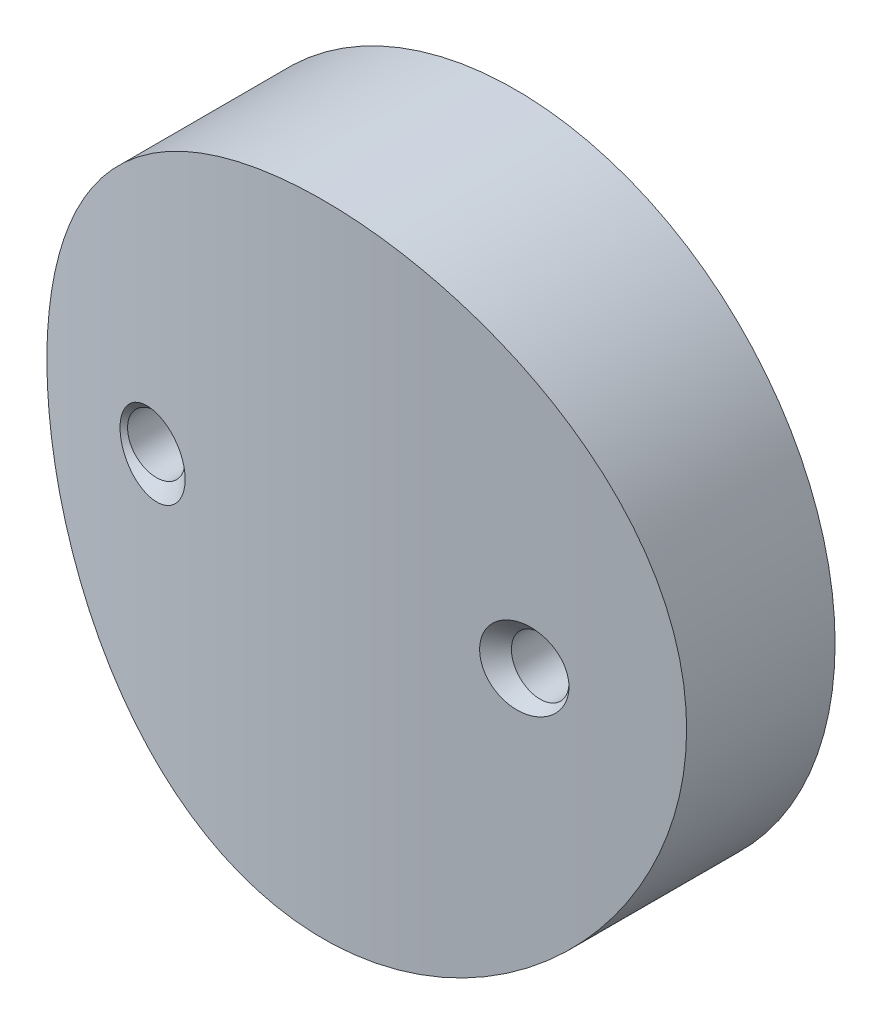
ISO-10303-21;
HEADER;
FILE_DESCRIPTION(('STEP AP214'),'2;1');
FILE_NAME('part.step','',(''),(''),'','','');
FILE_SCHEMA(('AUTOMOTIVE_DESIGN { 1 0 10303 214 1 1 1 1 }'));
ENDSEC;
DATA;
#1=APPLICATION_CONTEXT('core data for automotive mechanical design processes');
#2=APPLICATION_PROTOCOL_DEFINITION('international standard','automotive_design',2000,#1);
#3=PRODUCT_CONTEXT('',#1,'mechanical');
#4=PRODUCT('Part','Part','',(#3));
#5=PRODUCT_RELATED_PRODUCT_CATEGORY('part','',(#4));
#6=PRODUCT_DEFINITION_FORMATION('','',#4);
#7=PRODUCT_DEFINITION_CONTEXT('part definition',#1,'design');
#8=PRODUCT_DEFINITION('design','',#6,#7);
#9=PRODUCT_DEFINITION_SHAPE('','',#8);
#10=(LENGTH_UNIT() NAMED_UNIT(*) SI_UNIT(.MILLI.,.METRE.));
#11=(NAMED_UNIT(*) PLANE_ANGLE_UNIT() SI_UNIT($,.RADIAN.));
#12=(NAMED_UNIT(*) SI_UNIT($,.STERADIAN.) SOLID_ANGLE_UNIT());
#13=UNCERTAINTY_MEASURE_WITH_UNIT(LENGTH_MEASURE(1.E-05),#10,'distance_accuracy_value','');
#14=(GEOMETRIC_REPRESENTATION_CONTEXT(3) GLOBAL_UNCERTAINTY_ASSIGNED_CONTEXT((#13)) GLOBAL_UNIT_ASSIGNED_CONTEXT((#10,
#11,#12)) REPRESENTATION_CONTEXT('',''));
#15=CARTESIAN_POINT('',(0.,0.,0.));
#16=DIRECTION('',(0.,0.,1.));
#17=DIRECTION('',(1.,0.,0.));
#18=AXIS2_PLACEMENT_3D('',#15,#16,#17);
#19=CARTESIAN_POINT('',(0.,100.,12.001));
#20=DIRECTION('',(0.,0.,-1.));
#21=DIRECTION('',(-1.,0.,0.));
#22=AXIS2_PLACEMENT_3D('',#19,#20,#21);
#23=CYLINDRICAL_SURFACE('',#22,20.);
#24=CARTESIAN_POINT('',(0.,100.,0.));
#25=DIRECTION('',(0.,0.,1.));
#26=DIRECTION('',(1.,0.,0.));
#27=AXIS2_PLACEMENT_3D('',#24,#25,#26);
#28=CIRCLE('',#27,20.);
#29=CARTESIAN_POINT('',(20.,100.,0.));
#30=VERTEX_POINT('',#29);
#31=EDGE_CURVE('E43',#30,#30,#28,.T.);
#32=ORIENTED_EDGE('',*,*,#31,.T.);
#33=EDGE_LOOP('',(#32));
#34=FACE_BOUND('',#33,.T.);
#35=CARTESIAN_POINT('',(-20.,100.,9.28416147400479));
#36=CARTESIAN_POINT('',(-19.9999979955262,99.4490816313704,9.28416279580091));
#37=CARTESIAN_POINT('',(-19.9772172985185,98.8981249615404,9.2904769270564));
#38=CARTESIAN_POINT('',(-19.8862887267972,97.8002258474291,9.31554261359415));
#39=CARTESIAN_POINT('',(-19.818136610068,97.2532837833293,9.33429533182556));
#40=CARTESIAN_POINT('',(-19.6370216003391,96.1671652712574,9.38367345775294));
#41=CARTESIAN_POINT('',(-19.5240387775898,95.6279923877446,9.41430414573134));
#42=CARTESIAN_POINT('',(-19.2542283143095,94.561502969328,9.48651021139481));
#43=CARTESIAN_POINT('',(-19.0974015144497,94.0341862073026,9.52808537922789));
#44=CARTESIAN_POINT('',(-18.7414391089101,92.9957659565695,9.62087996482506));
#45=CARTESIAN_POINT('',(-18.5423642668867,92.4846403813565,9.67208551968243));
#46=CARTESIAN_POINT('',(-18.1033138320795,91.481199937916,9.78269878345931));
#47=CARTESIAN_POINT('',(-17.8633380829508,90.9888851416019,9.84210652373171));
#48=CARTESIAN_POINT('',(-17.3442340818241,90.0262034215537,9.9674503045261));
#49=CARTESIAN_POINT('',(-17.0651042648105,89.5558373761286,10.0333866059683));
#50=CARTESIAN_POINT('',(-16.4696340357336,88.6400041417255,10.1699694673951));
#51=CARTESIAN_POINT('',(-16.1532929930068,88.1945373749345,10.2406161072027));
#52=CARTESIAN_POINT('',(-15.4779359071113,87.3214778572301,10.3863439517671));
#53=CARTESIAN_POINT('',(-15.1181168094536,86.8945168185527,10.4614893018162));
#54=CARTESIAN_POINT('',(-14.3641394304632,86.072233894612,10.6126299952407));
#55=CARTESIAN_POINT('',(-13.9699806682643,85.6769124525539,10.6886253505059));
#56=CARTESIAN_POINT('',(-13.1498357209291,84.9204421049277,10.8393908335862));
#57=CARTESIAN_POINT('',(-12.7238463524525,84.5592966254637,10.9141608379413));
#58=CARTESIAN_POINT('',(-11.8428070794406,83.8736392228405,11.0604300185898));
#59=CARTESIAN_POINT('',(-11.3877570234234,83.5491274906629,11.1319291778303));
#60=CARTESIAN_POINT('',(-10.4440019186042,82.9340948969816,11.2708145890617));
#61=CARTESIAN_POINT('',(-9.95487366219161,82.6442038067541,11.3381163206586));
#62=CARTESIAN_POINT('',(-8.95295539825706,82.1067678347113,11.4654253046033));
#63=CARTESIAN_POINT('',(-8.44016506110064,81.859223543052,11.5254324552885));
#64=CARTESIAN_POINT('',(-7.39457532709894,81.4084882508209,11.6364292828246));
#65=CARTESIAN_POINT('',(-6.86177854741084,81.2052914724247,11.6874201342013));
#66=CARTESIAN_POINT('',(-5.77996599006893,80.8449220321236,11.7789182000641));
#67=CARTESIAN_POINT('',(-5.23095064420305,80.6877481461617,11.8194256933697));
#68=CARTESIAN_POINT('',(-4.13351206913607,80.4238601578316,11.8879789333952));
#69=CARTESIAN_POINT('',(-3.58536334092753,80.3160726833865,11.9162888769381));
#70=CARTESIAN_POINT('',(-2.4814919821342,80.1466883324669,11.9609717948869));
#71=CARTESIAN_POINT('',(-1.92576945639902,80.0850908172111,11.977344934372));
#72=CARTESIAN_POINT('',(-0.810972743979542,80.0086409767144,11.9976871281568));
#73=CARTESIAN_POINT('',(-0.251899056370223,79.9937818560937,12.0016579856462));
#74=CARTESIAN_POINT('',(0.865473785968113,80.0109243451164,11.9970870959432));
#75=CARTESIAN_POINT('',(1.42377295161553,80.0429252873166,11.9885455269695));
#76=CARTESIAN_POINT('',(2.52135571769306,80.1520981678641,11.9595660130407));
#77=CARTESIAN_POINT('',(3.06076341662817,80.2281086575775,11.9394340234098));
#78=CARTESIAN_POINT('',(4.13106184083255,80.4237319259216,11.8880589458923));
#79=CARTESIAN_POINT('',(4.66195273397212,80.5433438440421,11.8568160772884));
#80=CARTESIAN_POINT('',(5.71158477741187,80.8251959258982,11.7840530716063));
#81=CARTESIAN_POINT('',(6.23032550569826,80.9874375679151,11.7425325781311));
#82=CARTESIAN_POINT('',(7.25217189173379,81.3532705650216,11.650312846039));
#83=CARTESIAN_POINT('',(7.7552773024053,81.556862573169,11.5996134624586));
#84=CARTESIAN_POINT('',(8.74748028027973,82.0060818226882,11.4898194859816));
#85=CARTESIAN_POINT('',(9.23638947987451,82.2521058620114,11.4306466322478));
#86=CARTESIAN_POINT('',(10.1917867213777,82.7829692918916,11.3058518121301));
#87=CARTESIAN_POINT('',(10.6582746861091,83.0678088160437,11.2402298235499));
#88=CARTESIAN_POINT('',(11.5659888188201,83.6743783924377,11.1042412963293));
#89=CARTESIAN_POINT('',(12.0072108724652,83.9961144274876,11.0338739889947));
#90=CARTESIAN_POINT('',(12.86160363953,84.6743138427768,10.8902351506935));
#91=CARTESIAN_POINT('',(13.2747737611759,85.0307779552414,10.8169635585107));
#92=CARTESIAN_POINT('',(14.0827611991668,85.7876257785812,10.6671557118922));
#93=CARTESIAN_POINT('',(14.4766245221965,86.1890224381528,10.5905883226729));
#94=CARTESIAN_POINT('',(15.2292640199665,87.023663662894,10.4385250730246));
#95=CARTESIAN_POINT('',(15.5880394540543,87.4569089000012,10.3630292352433));
#96=CARTESIAN_POINT('',(16.2680947594536,88.3524583473953,10.2152321585712));
#97=CARTESIAN_POINT('',(16.5893720649617,88.8147645428476,10.1429311384955));
#98=CARTESIAN_POINT('',(17.192133875991,89.765388203695,10.0036044220981));
#99=CARTESIAN_POINT('',(17.4736185648671,90.2537055492225,9.93657870146968));
#100=CARTESIAN_POINT('',(17.9963259710692,91.2562147677768,9.80937506038609));
#101=CARTESIAN_POINT('',(18.2372879132319,91.7705484417095,9.74924223079678));
#102=CARTESIAN_POINT('',(18.6748920170533,92.8187094348841,9.63814020936753));
#103=CARTESIAN_POINT('',(18.8715338404755,93.3525369028601,9.58717108746262));
#104=CARTESIAN_POINT('',(19.2188038342948,94.4357402113817,9.49599876971939));
#105=CARTESIAN_POINT('',(19.3694413584335,94.9851128663764,9.45579338556878));
#106=CARTESIAN_POINT('',(19.6234178199717,96.0954178055354,9.3874216198644));
#107=CARTESIAN_POINT('',(19.726758202429,96.6563497359847,9.35925487049893));
#108=CARTESIAN_POINT('',(19.8828242188132,97.7685924306345,9.31652398335675));
#109=CARTESIAN_POINT('',(19.9369705715048,98.3196895369154,9.30157838257706));
#110=CARTESIAN_POINT('',(19.999379837248,99.424669527566,9.28434042019789));
#111=CARTESIAN_POINT('',(20.007643660691,99.9785523564438,9.28204780754049));
#112=CARTESIAN_POINT('',(19.9782160173178,101.084944616774,9.2901868221143));
#113=CARTESIAN_POINT('',(19.9405290358714,101.637454176999,9.30061720742275));
#114=CARTESIAN_POINT('',(19.8195451229315,102.737074698953,9.33387557665008));
#115=CARTESIAN_POINT('',(19.736248441784,103.284185690296,9.35670349252048));
#116=CARTESIAN_POINT('',(19.5268172340599,104.358574694533,9.41349951820374));
#117=CARTESIAN_POINT('',(19.4015386960339,104.886031740194,9.44724459132138));
#118=CARTESIAN_POINT('',(19.1088443049987,105.92832913383,9.52499551388795));
#119=CARTESIAN_POINT('',(18.9414291370062,106.443169686762,9.56900119652894));
#120=CARTESIAN_POINT('',(18.5657450389627,107.456898130884,9.6660217329505));
#121=CARTESIAN_POINT('',(18.3574721183883,107.955784458306,9.71903746666335));
#122=CARTESIAN_POINT('',(17.9016367197211,108.934361374954,9.8325926384959));
#123=CARTESIAN_POINT('',(17.6540733523817,109.414051529412,9.89313224689401));
#124=CARTESIAN_POINT('',(17.11548661598,110.361636468143,10.0214925631849));
#125=CARTESIAN_POINT('',(16.8236278146508,110.829040459727,10.0894440311411));
#126=CARTESIAN_POINT('',(16.3580352677298,111.510448657993,10.1945351891524));
#127=CARTESIAN_POINT('',(16.1981947427043,111.734312785837,10.2300948148337));
#128=CARTESIAN_POINT('',(15.8694473258497,112.175232006241,10.30203931338));
#129=CARTESIAN_POINT('',(15.7005382856018,112.392285465816,10.3384243806107));
#130=CARTESIAN_POINT('',(15.1806742573283,113.03262740184,10.4484348620577));
#131=CARTESIAN_POINT('',(14.8165313697738,113.445172032661,10.5229271869328));
#132=CARTESIAN_POINT('',(14.0555240451393,114.238838083619,10.6721964284326));
#133=CARTESIAN_POINT('',(13.6586592103083,114.619959121675,10.7469733485062));
#134=CARTESIAN_POINT('',(13.0347928155079,115.171495187348,10.8589235743963));
#135=CARTESIAN_POINT('',(12.8188356454708,115.354397584418,10.8967329624592));
#136=CARTESIAN_POINT('',(12.3793376328829,115.710889528931,10.9716276270557));
#137=CARTESIAN_POINT('',(12.1557986434177,115.884481325597,11.0087130770864));
#138=CARTESIAN_POINT('',(11.4742218917359,116.390928812047,11.1185122839076));
#139=CARTESIAN_POINT('',(11.0051905556007,116.709486469754,11.1897750240711));
#140=CARTESIAN_POINT('',(10.0412210351255,117.305930022683,11.3263808627377));
#141=CARTESIAN_POINT('',(9.54628362476042,117.583817132045,11.3917241379329));
#142=CARTESIAN_POINT('',(8.53378968620397,118.096863201607,11.5146590330854));
#143=CARTESIAN_POINT('',(8.01623352756529,118.332022859577,11.572250779627));
#144=CARTESIAN_POINT('',(6.96615659435087,118.756088506658,11.6776336514422));
#145=CARTESIAN_POINT('',(6.43377951172494,118.945332565737,11.7254959610589));
#146=CARTESIAN_POINT('',(5.35413230580837,119.278287553008,11.810603810812));
#147=CARTESIAN_POINT('',(4.80686220937867,119.421998563319,11.8478493700953));
#148=CARTESIAN_POINT('',(3.70156710346041,119.662610052446,11.9106449827694));
#149=CARTESIAN_POINT('',(3.14354409748073,119.759519165467,11.9361971933511));
#150=CARTESIAN_POINT('',(2.02086921872248,119.905690213793,11.9748725616934));
#151=CARTESIAN_POINT('',(1.45621751475103,119.954953359803,11.9879960352735));
#152=CARTESIAN_POINT('',(0.342006373503294,120.004609848884,12.0012258769284));
#153=CARTESIAN_POINT('',(-0.207484191740462,120.006457125849,12.0017195176386));
#154=CARTESIAN_POINT('',(-1.30462513984723,119.964951723101,11.9906587066234));
#155=CARTESIAN_POINT('',(-1.85227556263647,119.921600030522,11.9791045180198));
#156=CARTESIAN_POINT('',(-2.94176044403704,119.790076070703,11.9442666380802));
#157=CARTESIAN_POINT('',(-3.48359514787692,119.701905700952,11.9209834433156));
#158=CARTESIAN_POINT('',(-4.55762066338954,119.48149446132,11.86332430712));
#159=CARTESIAN_POINT('',(-5.08981143202368,119.349253394814,11.8289483161975));
#160=CARTESIAN_POINT('',(-6.13720586224473,119.042856430792,11.7503085861672));
#161=CARTESIAN_POINT('',(-6.65250160135733,118.868996968494,11.7061149287477));
#162=CARTESIAN_POINT('',(-7.66649937953354,118.480249488552,11.6088749781919));
#163=CARTESIAN_POINT('',(-8.16520155304267,118.265361803423,11.5558287568026));
#164=CARTESIAN_POINT('',(-9.14285422000933,117.796130197976,11.4422625249328));
#165=CARTESIAN_POINT('',(-9.6218026139965,117.541782097336,11.3817417227559));
#166=CARTESIAN_POINT('',(-10.5569031827026,116.995441768677,11.2547942715037));
#167=CARTESIAN_POINT('',(-11.0130548498786,116.703448703053,11.18836749103));
#168=CARTESIAN_POINT('',(-11.9116009680227,116.075513502516,11.0494829375575));
#169=CARTESIAN_POINT('',(-12.3533041573464,115.738607011052,10.976911573082));
#170=CARTESIAN_POINT('',(-13.2069343867793,115.029464192192,10.8292933222828));
#171=CARTESIAN_POINT('',(-13.6188608933488,114.65722723202,10.7542463916369));
#172=CARTESIAN_POINT('',(-14.4104174108039,113.879758554288,10.6036836894291));
#173=CARTESIAN_POINT('',(-14.7900392961781,113.474518585421,10.5281678050072));
#174=CARTESIAN_POINT('',(-15.5144184951873,112.633714559918,10.3787409432648));
#175=CARTESIAN_POINT('',(-15.8591756893648,112.198150399391,10.3048299714439));
#176=CARTESIAN_POINT('',(-16.5187203553849,111.289548436283,10.1590628608894));
#177=CARTESIAN_POINT('',(-16.8326805368298,110.815896583222,10.0872878300361));
#178=CARTESIAN_POINT('',(-17.4195128918304,109.842933134974,9.94965011832182));
#179=CARTESIAN_POINT('',(-17.6923831968983,109.343620374288,9.88378770638144));
#180=CARTESIAN_POINT('',(-18.1947791971653,108.323059432628,9.75999546091367));
#181=CARTESIAN_POINT('',(-18.424329875673,107.801824108278,9.70206106047311));
#182=CARTESIAN_POINT('',(-18.8383953760499,106.740847820869,9.59587184573519));
#183=CARTESIAN_POINT('',(-19.0229163281093,106.201109388183,9.54761571403154));
#184=CARTESIAN_POINT('',(-19.3189300896442,105.1967639913,9.46929221977677));
#185=CARTESIAN_POINT('',(-19.4374352166583,104.734340707335,9.43754006468277));
#186=CARTESIAN_POINT('',(-19.6411813358635,103.801567465641,9.38256119328311));
#187=CARTESIAN_POINT('',(-19.726413197448,103.33121536903,9.35933681721209));
#188=CARTESIAN_POINT('',(-19.8629973448247,102.385302182561,9.32196319394048));
#189=CARTESIAN_POINT('',(-19.9143527551861,101.90974157722,9.30781310978273));
#190=CARTESIAN_POINT('',(-19.9828499232124,100.956129746401,9.28891305807962));
#191=CARTESIAN_POINT('',(-20.0000017394545,100.478079294612,9.28416032696851));
#192=CARTESIAN_POINT('',(-20.,100.,9.28416147400479));
#193=B_SPLINE_CURVE_WITH_KNOTS('',3,(#35,#36,#37,#38,#39,#40,#41,#42,#43,#44,#45,#46,#47,#48,
#49,#50,#51,#52,#53,#54,#55,#56,#57,#58,#59,#60,#61,#62,#63,#64,#65,#66,#67,#68,#69,#70,#71,#72,
#73,#74,#75,#76,#77,#78,#79,#80,#81,#82,#83,#84,#85,#86,#87,#88,#89,#90,#91,#92,#93,#94,#95,#96,
#97,#98,#99,#100,#101,#102,#103,#104,#105,#106,#107,#108,#109,#110,#111,#112,#113,#114,#115,
#116,#117,#118,#119,#120,#121,#122,#123,#124,#125,#126,#127,#128,#129,#130,#131,#132,#133,#134,
#135,#136,#137,#138,#139,#140,#141,#142,#143,#144,#145,#146,#147,#148,#149,#150,#151,#152,#153,
#154,#155,#156,#157,#158,#159,#160,#161,#162,#163,#164,#165,#166,#167,#168,#169,#170,#171,#172,
#173,#174,#175,#176,#177,#178,#179,#180,#181,#182,#183,#184,#185,#186,#187,#188,#189,#190,#191,
#192),.UNSPECIFIED.,.T.,.F.,(4,2,2,2,2,2,2,2,2,2,2,2,2,2,2,2,2,2,2,2,2,2,2,2,2,2,2,2,2,2,2,2,2,
2,2,2,2,2,2,2,2,2,2,2,2,2,2,2,2,2,2,2,2,2,2,2,2,2,2,2,2,2,2,2,2,2,2,2,2,2,2,2,2,2,2,2,2,2,4),
(0.,1.65231646724919,3.30478744006707,4.95799385294114,6.61116856915921,8.26198151246524,
9.91280076618767,11.563686023129,13.2145992636445,14.9028332573599,16.5910908956041,
18.2795176009991,19.9679531082101,21.6835116813128,23.3990941609388,25.1144529919578,
26.8297661959518,28.5057881570069,30.1817869391872,31.8575420336015,33.5332732599203,
35.1666751391554,36.8000447836081,38.4334710762973,40.0669231681476,41.716572363803,
43.3662272373671,45.016149983437,46.6661075248884,48.3667622821504,50.0674529299349,
51.7682598790723,53.4690589910375,55.1804159110329,56.8917858911011,58.6028076779203,
60.3137771848222,61.9735992876109,63.6333884564392,65.2930156221762,66.9526336785195,
68.5802863037356,70.2079124698566,71.8356976833209,73.4635197431163,75.127110556269,
75.9589916893301,76.7910707802654,78.454956484337,80.1188624167173,80.9751899408172,
81.831309655657,83.54341297765,85.2554651776657,86.9674894160441,88.6664972596542,
90.3655020391462,92.0641932594964,93.7628413142374,95.4093386147798,97.0557999569513,
98.7021915986812,100.348590586058,101.983594533906,103.618585231283,105.253749253225,
106.888949664009,108.567756622398,110.246593654259,111.925851719845,113.605115538909,
115.321363854389,117.037690189607,118.753023639167,120.468123438766,121.902141616166,
123.336553030226,124.77083212392,126.204689363247),.UNSPECIFIED.);
#194=CARTESIAN_POINT('',(-20.,100.,9.28416147400479));
#195=VERTEX_POINT('',#194);
#196=EDGE_CURVE('E10',#195,#195,#193,.T.);
#197=ORIENTED_EDGE('',*,*,#196,.F.);
#198=EDGE_LOOP('',(#197));
#199=FACE_BOUND('',#198,.T.);
#200=ADVANCED_FACE('F30',(#34,#199),#23,.T.);
#201=CARTESIAN_POINT('',(0.,100.,0.));
#202=DIRECTION('',(0.,0.,1.));
#203=DIRECTION('',(1.,0.,0.));
#204=AXIS2_PLACEMENT_3D('',#201,#202,#203);
#205=PLANE('',#204);
#206=CARTESIAN_POINT('',(12.,100.,0.));
#207=DIRECTION('',(0.,0.,1.));
#208=DIRECTION('',(1.,0.,0.));
#209=AXIS2_PLACEMENT_3D('',#206,#207,#208);
#210=CIRCLE('',#209,1.8);
#211=CARTESIAN_POINT('',(13.8,100.,0.));
#212=VERTEX_POINT('',#211);
#213=EDGE_CURVE('E90',#212,#212,#210,.T.);
#214=ORIENTED_EDGE('',*,*,#213,.T.);
#215=EDGE_LOOP('',(#214));
#216=FACE_BOUND('',#215,.T.);
#217=CARTESIAN_POINT('',(-12.,100.,0.));
#218=DIRECTION('',(0.,0.,1.));
#219=DIRECTION('',(1.,0.,0.));
#220=AXIS2_PLACEMENT_3D('',#217,#218,#219);
#221=CIRCLE('',#220,1.8);
#222=CARTESIAN_POINT('',(-10.2,100.,0.));
#223=VERTEX_POINT('',#222);
#224=EDGE_CURVE('E97',#223,#223,#221,.T.);
#225=ORIENTED_EDGE('',*,*,#224,.T.);
#226=EDGE_LOOP('',(#225));
#227=FACE_BOUND('',#226,.T.);
#228=ORIENTED_EDGE('',*,*,#31,.F.);
#229=EDGE_LOOP('',(#228));
#230=FACE_BOUND('',#229,.T.);
#231=ADVANCED_FACE('F61',(#216,#227,#230),#205,.F.);
#232=CARTESIAN_POINT('',(0.,150.,-63.));
#233=DIRECTION('',(0.,-1.,0.));
#234=DIRECTION('',(1.,0.,0.));
#235=AXIS2_PLACEMENT_3D('',#232,#233,#234);
#236=CYLINDRICAL_SURFACE('',#235,75.);
#237=CARTESIAN_POINT('',(10.0147115624541,98.1872877617401,11.3283630407723));
#238=CARTESIAN_POINT('',(10.1137053734939,98.0986580078129,11.3150247685234));
#239=CARTESIAN_POINT('',(10.2200264717651,98.0182626778006,11.3004971381301));
#240=CARTESIAN_POINT('',(10.4443450340624,97.8761916392404,11.2692970675332));
#241=CARTESIAN_POINT('',(10.5623554199033,97.8145369605952,11.2526222474925));
#242=CARTESIAN_POINT('',(10.8089884825302,97.710684519848,11.2171243816948));
#243=CARTESIAN_POINT('',(10.9377672230245,97.6688682485781,11.1982672699758));
#244=CARTESIAN_POINT('',(11.2002779942649,97.6074962347434,11.1590950480397));
#245=CARTESIAN_POINT('',(11.3340093457083,97.5879374509206,11.1387801374192));
#246=CARTESIAN_POINT('',(11.6037659722418,97.5714183640229,11.0970403126719));
#247=CARTESIAN_POINT('',(11.7398010122652,97.5746364875947,11.0756079429764));
#248=CARTESIAN_POINT('',(12.00934175402,97.6038899296518,11.0323871750071));
#249=CARTESIAN_POINT('',(12.142847224785,97.6299273215276,11.0105987445577));
#250=CARTESIAN_POINT('',(12.4049697925237,97.7044063987564,10.9671180969283));
#251=CARTESIAN_POINT('',(12.5335239889394,97.7530714491222,10.9454290677138));
#252=CARTESIAN_POINT('',(12.7807071527235,97.8715061809724,10.9031072852411));
#253=CARTESIAN_POINT('',(12.8993357182183,97.9412767164581,10.8824745747647));
#254=CARTESIAN_POINT('',(13.1237267695872,98.100315449652,10.8429471341469));
#255=CARTESIAN_POINT('',(13.2294399443273,98.1896549476397,10.8240591283594));
#256=CARTESIAN_POINT('',(13.4243854223804,98.3852333340693,10.7888589829341));
#257=CARTESIAN_POINT('',(13.5136183726288,98.4914715588424,10.7725467421876));
#258=CARTESIAN_POINT('',(13.6722016108154,98.7169112173467,10.7433208515175));
#259=CARTESIAN_POINT('',(13.741716345703,98.8359932651813,10.7303791706968));
#260=CARTESIAN_POINT('',(13.8596954789139,99.0844905687288,10.7082930469887));
#261=CARTESIAN_POINT('',(13.9081620710863,99.2139047458579,10.6991482083606));
#262=CARTESIAN_POINT('',(13.9818483107985,99.4770754823459,10.6852041528412));
#263=CARTESIAN_POINT('',(14.00744251675,99.6107234911741,10.6803349422514));
#264=CARTESIAN_POINT('',(14.0359232802531,99.8804998178369,10.6749148278843));
#265=CARTESIAN_POINT('',(14.0388117599033,100.016627924747,10.6743635585821));
#266=CARTESIAN_POINT('',(14.0218943257862,100.285753616693,10.6775851022239));
#267=CARTESIAN_POINT('',(14.0023622235728,100.418769153154,10.6813057445442));
#268=CARTESIAN_POINT('',(13.9416746655816,100.679583829042,10.6928127511121));
#269=CARTESIAN_POINT('',(13.9005192051768,100.807382967352,10.7005991162297));
#270=CARTESIAN_POINT('',(13.797745845387,101.054508643279,10.7199086604199));
#271=CARTESIAN_POINT('',(13.7360805281757,101.173814762133,10.7314404973841));
#272=CARTESIAN_POINT('',(13.5941669790984,101.400409272627,10.7577373130756));
#273=CARTESIAN_POINT('',(13.5139173813574,101.507696780085,10.7725025294398));
#274=CARTESIAN_POINT('',(13.3358474727158,101.708904519537,10.8049013248899));
#275=CARTESIAN_POINT('',(13.2377869675637,101.802605887394,10.8225737576101));
#276=CARTESIAN_POINT('',(13.0276985081102,101.972269626918,10.8599379786512));
#277=CARTESIAN_POINT('',(12.9156692930308,102.048230395586,10.8796299492217));
#278=CARTESIAN_POINT('',(12.6789064018561,102.181439658753,10.920632898144));
#279=CARTESIAN_POINT('',(12.554002820863,102.238380089836,10.9419642292788));
#280=CARTESIAN_POINT('',(12.2964626230062,102.330329725032,10.9852285623924));
#281=CARTESIAN_POINT('',(12.1638256822613,102.36533800988,11.0071615895503));
#282=CARTESIAN_POINT('',(11.8937677189398,102.41252038409,11.0510438574771));
#283=CARTESIAN_POINT('',(11.7563242543843,102.424566834448,11.0729925142933));
#284=CARTESIAN_POINT('',(11.4812777537069,102.42498582436,11.1161226491143));
#285=CARTESIAN_POINT('',(11.3436747222945,102.413359045693,11.137304149195));
#286=CARTESIAN_POINT('',(11.0731196744464,102.366778378788,11.1781951405087));
#287=CARTESIAN_POINT('',(10.9401446108977,102.331965613931,11.1979127397541));
#288=CARTESIAN_POINT('',(10.6818684028959,102.240036851795,11.2355354895243));
#289=CARTESIAN_POINT('',(10.5565667934781,102.182922207425,11.2534407499088));
#290=CARTESIAN_POINT('',(10.3185791411572,102.048662933914,11.2868846949843));
#291=CARTESIAN_POINT('',(10.2057766154114,101.971730325882,11.3024458231386));
#292=CARTESIAN_POINT('',(9.99461549987925,101.799729440422,11.3311444530888));
#293=CARTESIAN_POINT('',(9.89625639667816,101.704661807909,11.3442820410377));
#294=CARTESIAN_POINT('',(9.71740869313529,101.499763526766,11.3678699229678));
#295=CARTESIAN_POINT('',(9.63681235669409,101.390028752841,11.3783364823088));
#296=CARTESIAN_POINT('',(9.49500965513028,101.158473166225,11.3965719751555));
#297=CARTESIAN_POINT('',(9.43380331634857,101.036652337116,11.4043409049964));
#298=CARTESIAN_POINT('',(9.33250223442704,100.784385110388,11.4171151286588));
#299=CARTESIAN_POINT('',(9.29240898153087,100.653938104631,11.4221202273995));
#300=CARTESIAN_POINT('',(9.23445662850605,100.388125046375,11.4293334124725));
#301=CARTESIAN_POINT('',(9.21659710914521,100.252759086676,11.4315415515433));
#302=CARTESIAN_POINT('',(9.20358652080018,99.9805771396471,11.4331514923544));
#303=CARTESIAN_POINT('',(9.2084935095809,99.8437583337955,11.4325461192402));
#304=CARTESIAN_POINT('',(9.24102011645419,99.5728536456085,11.4285147629221));
#305=CARTESIAN_POINT('',(9.26864510279682,99.4387684168909,11.4250881130518));
#306=CARTESIAN_POINT('',(9.34587525373025,99.1770483401228,11.4154293271851));
#307=CARTESIAN_POINT('',(9.39550349191579,99.0494204204364,11.4091942460322));
#308=CARTESIAN_POINT('',(9.51532115991074,98.8045131040988,11.3939667122936));
#309=CARTESIAN_POINT('',(9.58548691234423,98.6872219917886,11.3849774344229));
#310=CARTESIAN_POINT('',(9.71596338337791,98.5057037924365,11.3680220108522));
#311=CARTESIAN_POINT('',(9.77088012865525,98.4374583923596,11.3608322144049));
#312=CARTESIAN_POINT('',(9.88771296694719,98.3073850621139,11.3453872840222));
#313=CARTESIAN_POINT('',(9.94962872065156,98.2455568211213,11.3371322017287));
#314=CARTESIAN_POINT('',(10.0147115624541,98.1872877617401,11.3283630407723));
#315=B_SPLINE_CURVE_WITH_KNOTS('',3,(#237,#238,#239,#240,#241,#242,#243,#244,#245,#246,#247,
#248,#249,#250,#251,#252,#253,#254,#255,#256,#257,#258,#259,#260,#261,#262,#263,#264,#265,#266,
#267,#268,#269,#270,#271,#272,#273,#274,#275,#276,#277,#278,#279,#280,#281,#282,#283,#284,#285,
#286,#287,#288,#289,#290,#291,#292,#293,#294,#295,#296,#297,#298,#299,#300,#301,#302,#303,#304,
#305,#306,#307,#308,#309,#310,#311,#312,#313,#314),.UNSPECIFIED.,.T.,.F.,(4,2,2,2,2,2,2,2,2,2,2,
2,2,2,2,2,2,2,2,2,2,2,2,2,2,2,2,2,2,2,2,2,2,2,2,2,2,2,4),(0.,0.400310687438839,
0.801068940819024,1.20924926977042,1.61737381835742,2.02869899644799,2.44006155199398,
2.85557393802004,3.27110313937635,3.68817229638677,4.10522507775933,4.51868993860095,
4.93211169362634,5.33863214799829,5.74511818899127,6.14669235528073,6.54826660749686,
6.95077581003124,7.35331460487806,7.76175076956237,8.17022382530727,8.58502382335432,
8.99984120615187,9.41695780441807,9.83406239007704,10.24865115702,10.6632147774906,
11.0735151769535,11.4838009880929,11.8915252838126,12.2992501334147,12.7070037579649,
13.1147496939264,13.5235360094812,13.9324189487777,14.3417316789162,14.750574365152,
15.0137687956836,15.2769504720815),.UNSPECIFIED.);
#316=CARTESIAN_POINT('',(10.0147115624541,98.1872877617401,11.3283630407723));
#317=VERTEX_POINT('',#316);
#318=EDGE_CURVE('E35',#317,#317,#315,.T.);
#319=ORIENTED_EDGE('',*,*,#318,.F.);
#320=EDGE_LOOP('',(#319));
#321=FACE_BOUND('',#320,.T.);
#322=CARTESIAN_POINT('',(-13.0612004536928,98.0569607357173,10.8539439890306));
#323=CARTESIAN_POINT('',(-12.9510321252875,97.974599230323,10.8734271083636));
#324=CARTESIAN_POINT('',(-12.8338719777217,97.9016441387576,10.8938911657025));
#325=CARTESIAN_POINT('',(-12.5889457705532,97.7766420054563,10.9360122293658));
#326=CARTESIAN_POINT('',(-12.4611660051289,97.7246225053743,10.957670764788));
#327=CARTESIAN_POINT('',(-12.1987076752587,97.6430566165099,11.0014135459655));
#328=CARTESIAN_POINT('',(-12.0640305951828,97.6135054138407,11.0234976994909));
#329=CARTESIAN_POINT('',(-11.7916048063762,97.577781384859,11.0673820318161));
#330=CARTESIAN_POINT('',(-11.6538570196654,97.5716016335903,11.0891822928252));
#331=CARTESIAN_POINT('',(-11.3794624186264,97.5828793089873,11.1318222771441));
#332=CARTESIAN_POINT('',(-11.2428139387902,97.6002888569523,11.1526638575798));
#333=CARTESIAN_POINT('',(-10.9742975197117,97.6582948413268,11.1928785710441));
#334=CARTESIAN_POINT('',(-10.8424295471032,97.6988911158676,11.212251714323));
#335=CARTESIAN_POINT('',(-10.5886284851775,97.8016934896443,11.248887149845));
#336=CARTESIAN_POINT('',(-10.4666104323481,97.8636831015335,11.2661683305555));
#337=CARTESIAN_POINT('',(-10.2346606824485,98.0076379750879,11.2984888872316));
#338=CARTESIAN_POINT('',(-10.1247283411188,98.0896021712072,11.3135283827111));
#339=CARTESIAN_POINT('',(-9.92104655666905,98.2703989553967,11.3409936106729));
#340=CARTESIAN_POINT('',(-9.82716854545535,98.3690835708812,11.3534403015768));
#341=CARTESIAN_POINT('',(-9.65717818059106,98.5809791233678,11.3757102798694));
#342=CARTESIAN_POINT('',(-9.58106556097766,98.6941898428627,11.3855336065324));
#343=CARTESIAN_POINT('',(-9.44891789234651,98.9316453560986,11.4024354289514));
#344=CARTESIAN_POINT('',(-9.39284066225965,99.055866272859,11.4095196939477));
#345=CARTESIAN_POINT('',(-9.30210988015713,99.3120199370351,11.4209167907988));
#346=CARTESIAN_POINT('',(-9.26745665480694,99.4439528020064,11.4252295803953));
#347=CARTESIAN_POINT('',(-9.22048239778925,99.712108087909,11.4310639030406));
#348=CARTESIAN_POINT('',(-9.20821277613766,99.8483396544009,11.4325790105508));
#349=CARTESIAN_POINT('',(-9.20650201263597,100.120949265591,11.4327906335435));
#350=CARTESIAN_POINT('',(-9.2170611422745,100.257327312011,11.4314871155057));
#351=CARTESIAN_POINT('',(-9.26075492240073,100.526607119753,11.4260632924554));
#352=CARTESIAN_POINT('',(-9.29392899428517,100.659502389288,11.4219380687239));
#353=CARTESIAN_POINT('',(-9.3819668105927,100.91778063155,11.4108906886116));
#354=CARTESIAN_POINT('',(-9.43683033325463,101.04316368107,11.4039685608274));
#355=CARTESIAN_POINT('',(-9.56660163357784,101.282653430498,11.387394002822));
#356=CARTESIAN_POINT('',(-9.64148000409578,101.396776340425,11.3777455770805));
#357=CARTESIAN_POINT('',(-9.80917916989661,101.610683428602,11.3558143807123));
#358=CARTESIAN_POINT('',(-9.90199955384029,101.710467935482,11.3435316704786));
#359=CARTESIAN_POINT('',(-10.1026566941489,101.892625802653,11.3165293027906));
#360=CARTESIAN_POINT('',(-10.2104556753073,101.975041689217,11.3018157586536));
#361=CARTESIAN_POINT('',(-10.4381362394002,102.120468295892,11.2701723546836));
#362=CARTESIAN_POINT('',(-10.5580178006212,102.183479050873,11.2532424988336));
#363=CARTESIAN_POINT('',(-10.8066011473676,102.288464992718,11.2174719777726));
#364=CARTESIAN_POINT('',(-10.9353154696126,102.330409546918,11.1986285776049));
#365=CARTESIAN_POINT('',(-11.1977472714172,102.392058346626,11.159477145347));
#366=CARTESIAN_POINT('',(-11.3314649487244,102.411761712135,11.1391690553385));
#367=CARTESIAN_POINT('',(-11.6012089467802,102.428568466305,11.0974406908799));
#368=CARTESIAN_POINT('',(-11.7372451360536,102.425494734228,11.0760129893651));
#369=CARTESIAN_POINT('',(-12.0068087159716,102.396528450863,11.0327980472289));
#370=CARTESIAN_POINT('',(-12.1403359416002,102.370634403997,11.0110107831347));
#371=CARTESIAN_POINT('',(-12.4025279591824,102.296437900148,10.9675276387976));
#372=CARTESIAN_POINT('',(-12.5311299707225,102.247911618644,10.9458349074764));
#373=CARTESIAN_POINT('',(-12.7784311618901,102.129745274493,10.9035009560284));
#374=CARTESIAN_POINT('',(-12.8971299457333,102.060104368511,10.8828597779401));
#375=CARTESIAN_POINT('',(-13.1216863917726,101.901310191054,10.8433098627825));
#376=CARTESIAN_POINT('',(-13.227494395657,101.812084955889,10.8244078899434));
#377=CARTESIAN_POINT('',(-13.4226481234037,101.616717570443,10.7891751697615));
#378=CARTESIAN_POINT('',(-13.5119944332962,101.510576022627,10.7728443308904));
#379=CARTESIAN_POINT('',(-13.6708216000767,101.285304477622,10.7435768316038));
#380=CARTESIAN_POINT('',(-13.7404660894625,101.166293544677,10.7306122913971));
#381=CARTESIAN_POINT('',(-13.8587149085104,100.917914773382,10.7084775330597));
#382=CARTESIAN_POINT('',(-13.9073213952862,100.788547998473,10.6993069259255));
#383=CARTESIAN_POINT('',(-13.9812917578251,100.525442744444,10.6853098304655));
#384=CARTESIAN_POINT('',(-14.0070295073137,100.391813061746,10.6804134877974));
#385=CARTESIAN_POINT('',(-14.0357961925262,100.122053472953,10.6749390679457));
#386=CARTESIAN_POINT('',(-14.0388279657029,99.9859238813915,10.6743604511973));
#387=CARTESIAN_POINT('',(-14.022194022048,99.7167899918877,10.6775280509862));
#388=CARTESIAN_POINT('',(-14.0028052360675,99.5837678310524,10.6812215006056));
#389=CARTESIAN_POINT('',(-13.9423925672615,99.3228803830203,10.6926768658786));
#390=CARTESIAN_POINT('',(-13.9013633364842,99.1950163789585,10.7004397872082));
#391=CARTESIAN_POINT('',(-13.7988154137493,98.9476994280695,10.7197084190457));
#392=CARTESIAN_POINT('',(-13.7372407756083,98.8282705383454,10.731224347165));
#393=CARTESIAN_POINT('',(-13.5955221149688,98.601526050756,10.7574873325573));
#394=CARTESIAN_POINT('',(-13.5153986668647,98.4941972261725,10.7722308088461));
#395=CARTESIAN_POINT('',(-13.37210384226,98.3319285160797,10.7983060308951));
#396=CARTESIAN_POINT('',(-13.3138490218131,98.2724399500512,10.8088427713221));
#397=CARTESIAN_POINT('',(-13.1916453811187,98.1598121781801,10.8307818775758));
#398=CARTESIAN_POINT('',(-13.1276965341667,98.1066730021184,10.8421842474623));
#399=CARTESIAN_POINT('',(-13.0612004536928,98.0569607357173,10.8539439890306));
#400=B_SPLINE_CURVE_WITH_KNOTS('',3,(#322,#323,#324,#325,#326,#327,#328,#329,#330,#331,#332,
#333,#334,#335,#336,#337,#338,#339,#340,#341,#342,#343,#344,#345,#346,#347,#348,#349,#350,#351,
#352,#353,#354,#355,#356,#357,#358,#359,#360,#361,#362,#363,#364,#365,#366,#367,#368,#369,#370,
#371,#372,#373,#374,#375,#376,#377,#378,#379,#380,#381,#382,#383,#384,#385,#386,#387,#388,#389,
#390,#391,#392,#393,#394,#395,#396,#397,#398,#399),.UNSPECIFIED.,.T.,.F.,(4,2,2,2,2,2,2,2,2,2,2,
2,2,2,2,2,2,2,2,2,2,2,2,2,2,2,2,2,2,2,2,2,2,2,2,2,2,2,4),(0.,0.416467255971157,
0.833480615216321,1.25040460314998,1.66720504690847,2.08316078564499,2.49911362059249,
2.91097504048286,3.32281449439818,3.73118333177485,4.13954605513525,4.54704390324905,
4.95454796458955,5.36298679682117,5.77143048639731,6.18058798421997,6.58974129876956,
6.99829673138973,7.40684279856509,7.81437662919547,8.22190972746394,8.63003372203993,
9.03817386396005,9.44949112336914,9.86083534133886,10.2763367866706,10.6918548296443,
11.1089260688671,11.5259824576415,11.9394658652087,12.3529068665565,12.7594572098401,
13.1659567477041,13.5674884973035,13.9691195230161,14.3718532591484,14.7741424042369,
15.0255151052831,15.2768889853146),.UNSPECIFIED.);
#401=CARTESIAN_POINT('',(-13.0612004536928,98.0569607357173,10.8539439890306));
#402=VERTEX_POINT('',#401);
#403=EDGE_CURVE('E48',#402,#402,#400,.T.);
#404=ORIENTED_EDGE('',*,*,#403,.F.);
#405=EDGE_LOOP('',(#404));
#406=FACE_BOUND('',#405,.T.);
#407=ORIENTED_EDGE('',*,*,#196,.T.);
#408=EDGE_LOOP('',(#407));
#409=FACE_BOUND('',#408,.T.);
#410=ADVANCED_FACE('F32',(#321,#406,#409),#236,.T.);
#411=CARTESIAN_POINT('',(-12.,100.,12.));
#412=DIRECTION('',(0.,0.,1.));
#413=DIRECTION('',(1.,0.,0.));
#414=AXIS2_PLACEMENT_3D('',#411,#412,#413);
#415=CYLINDRICAL_SURFACE('',#414,1.8);
#416=ORIENTED_EDGE('',*,*,#224,.F.);
#417=EDGE_LOOP('',(#416));
#418=FACE_BOUND('',#417,.T.);
#419=CARTESIAN_POINT('',(-12.,100.,10.44));
#420=DIRECTION('',(0.,0.,1.));
#421=DIRECTION('',(1.,0.,0.));
#422=AXIS2_PLACEMENT_3D('',#419,#420,#421);
#423=CIRCLE('',#422,1.8);
#424=CARTESIAN_POINT('',(-10.2,100.,10.44));
#425=VERTEX_POINT('',#424);
#426=EDGE_CURVE('E95',#425,#425,#423,.T.);
#427=ORIENTED_EDGE('',*,*,#426,.T.);
#428=EDGE_LOOP('',(#427));
#429=FACE_BOUND('',#428,.T.);
#430=ADVANCED_FACE('F66',(#418,#429),#415,.F.);
#431=CARTESIAN_POINT('',(-12.,100.,12.));
#432=DIRECTION('',(0.,0.,1.));
#433=DIRECTION('',(1.,0.,0.));
#434=AXIS2_PLACEMENT_3D('',#431,#432,#433);
#435=CONICAL_SURFACE('',#434,3.36,0.785398163397449);
#436=ORIENTED_EDGE('',*,*,#403,.T.);
#437=EDGE_LOOP('',(#436));
#438=FACE_BOUND('',#437,.T.);
#439=ORIENTED_EDGE('',*,*,#426,.F.);
#440=EDGE_LOOP('',(#439));
#441=FACE_BOUND('',#440,.T.);
#442=ADVANCED_FACE('F68',(#438,#441),#435,.F.);
#443=CARTESIAN_POINT('',(12.,100.,12.));
#444=DIRECTION('',(0.,0.,1.));
#445=DIRECTION('',(1.,0.,0.));
#446=AXIS2_PLACEMENT_3D('',#443,#444,#445);
#447=CYLINDRICAL_SURFACE('',#446,1.8);
#448=ORIENTED_EDGE('',*,*,#213,.F.);
#449=EDGE_LOOP('',(#448));
#450=FACE_BOUND('',#449,.T.);
#451=CARTESIAN_POINT('',(12.,100.,10.44));
#452=DIRECTION('',(0.,0.,1.));
#453=DIRECTION('',(1.,0.,0.));
#454=AXIS2_PLACEMENT_3D('',#451,#452,#453);
#455=CIRCLE('',#454,1.8);
#456=CARTESIAN_POINT('',(13.8,100.,10.44));
#457=VERTEX_POINT('',#456);
#458=EDGE_CURVE('E88',#457,#457,#455,.T.);
#459=ORIENTED_EDGE('',*,*,#458,.T.);
#460=EDGE_LOOP('',(#459));
#461=FACE_BOUND('',#460,.T.);
#462=ADVANCED_FACE('F73',(#450,#461),#447,.F.);
#463=CARTESIAN_POINT('',(12.,100.,12.));
#464=DIRECTION('',(0.,0.,1.));
#465=DIRECTION('',(1.,0.,0.));
#466=AXIS2_PLACEMENT_3D('',#463,#464,#465);
#467=CONICAL_SURFACE('',#466,3.36,0.785398163397449);
#468=ORIENTED_EDGE('',*,*,#318,.T.);
#469=EDGE_LOOP('',(#468));
#470=FACE_BOUND('',#469,.T.);
#471=ORIENTED_EDGE('',*,*,#458,.F.);
#472=EDGE_LOOP('',(#471));
#473=FACE_BOUND('',#472,.T.);
#474=ADVANCED_FACE('F76',(#470,#473),#467,.F.);
#475=CLOSED_SHELL('',(#200,#231,#410,#430,#442,#462,#474));
#476=MANIFOLD_SOLID_BREP('B2',#475);
#477=ADVANCED_BREP_SHAPE_REPRESENTATION('',(#18,#476),#14);
#478=SHAPE_DEFINITION_REPRESENTATION(#9,#477);
ENDSEC;
END-ISO-10303-21;
